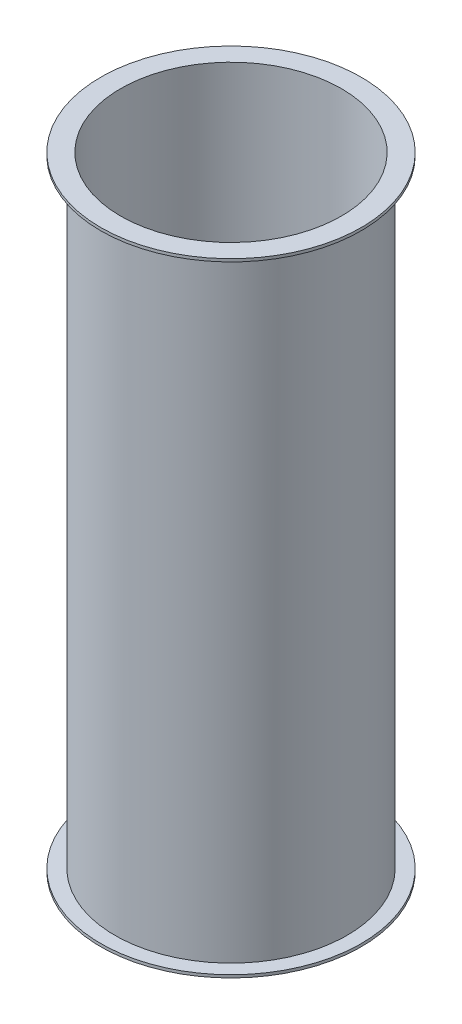
ISO-10303-21;
HEADER;
FILE_DESCRIPTION(('STEP AP214'),'2;1');
FILE_NAME('part.step','',(''),(''),'','','');
FILE_SCHEMA(('AUTOMOTIVE_DESIGN { 1 0 10303 214 1 1 1 1 }'));
ENDSEC;
DATA;
#1=APPLICATION_CONTEXT('core data for automotive mechanical design processes');
#2=APPLICATION_PROTOCOL_DEFINITION('international standard','automotive_design',2000,#1);
#3=PRODUCT_CONTEXT('',#1,'mechanical');
#4=PRODUCT('Part','Part','',(#3));
#5=PRODUCT_RELATED_PRODUCT_CATEGORY('part','',(#4));
#6=PRODUCT_DEFINITION_FORMATION('','',#4);
#7=PRODUCT_DEFINITION_CONTEXT('part definition',#1,'design');
#8=PRODUCT_DEFINITION('design','',#6,#7);
#9=PRODUCT_DEFINITION_SHAPE('','',#8);
#10=(LENGTH_UNIT() NAMED_UNIT(*) SI_UNIT(.MILLI.,.METRE.));
#11=(NAMED_UNIT(*) PLANE_ANGLE_UNIT() SI_UNIT($,.RADIAN.));
#12=(NAMED_UNIT(*) SI_UNIT($,.STERADIAN.) SOLID_ANGLE_UNIT());
#13=UNCERTAINTY_MEASURE_WITH_UNIT(LENGTH_MEASURE(1.E-05),#10,'distance_accuracy_value','');
#14=(GEOMETRIC_REPRESENTATION_CONTEXT(3) GLOBAL_UNCERTAINTY_ASSIGNED_CONTEXT((#13)) GLOBAL_UNIT_ASSIGNED_CONTEXT((#10,
#11,#12)) REPRESENTATION_CONTEXT('',''));
#15=CARTESIAN_POINT('',(0.,0.,0.));
#16=DIRECTION('',(0.,0.,1.));
#17=DIRECTION('',(1.,0.,0.));
#18=AXIS2_PLACEMENT_3D('',#15,#16,#17);
#19=CARTESIAN_POINT('',(0.,110.,0.));
#20=DIRECTION('',(0.,-1.,0.));
#21=DIRECTION('',(0.,0.,-1.));
#22=AXIS2_PLACEMENT_3D('',#19,#20,#21);
#23=CYLINDRICAL_SURFACE('',#22,41.);
#24=CARTESIAN_POINT('',(0.,109.,0.));
#25=DIRECTION('',(0.,1.,0.));
#26=DIRECTION('',(0.,0.,1.));
#27=AXIS2_PLACEMENT_3D('',#24,#25,#26);
#28=CIRCLE('',#27,41.);
#29=CARTESIAN_POINT('',(0.,109.,41.));
#30=VERTEX_POINT('',#29);
#31=EDGE_CURVE('E43',#30,#30,#28,.T.);
#32=ORIENTED_EDGE('',*,*,#31,.F.);
#33=EDGE_LOOP('',(#32));
#34=FACE_BOUND('',#33,.T.);
#35=CARTESIAN_POINT('',(0.,-109.,0.));
#36=DIRECTION('',(0.,-1.,0.));
#37=DIRECTION('',(0.,0.,-1.));
#38=AXIS2_PLACEMENT_3D('',#35,#36,#37);
#39=CIRCLE('',#38,41.);
#40=CARTESIAN_POINT('',(0.,-109.,-41.));
#41=VERTEX_POINT('',#40);
#42=EDGE_CURVE('E11',#41,#41,#39,.T.);
#43=ORIENTED_EDGE('',*,*,#42,.F.);
#44=EDGE_LOOP('',(#43));
#45=FACE_BOUND('',#44,.T.);
#46=ADVANCED_FACE('F37',(#34,#45),#23,.T.);
#47=CARTESIAN_POINT('',(0.,110.,0.));
#48=DIRECTION('',(0.,1.,0.));
#49=DIRECTION('',(0.,0.,1.));
#50=AXIS2_PLACEMENT_3D('',#47,#48,#49);
#51=PLANE('',#50);
#52=CARTESIAN_POINT('',(0.,110.,0.));
#53=DIRECTION('',(0.,1.,0.));
#54=DIRECTION('',(0.,0.,1.));
#55=AXIS2_PLACEMENT_3D('',#52,#53,#54);
#56=CIRCLE('',#55,39.);
#57=CARTESIAN_POINT('',(0.,110.,39.));
#58=VERTEX_POINT('',#57);
#59=EDGE_CURVE('E47',#58,#58,#56,.T.);
#60=ORIENTED_EDGE('',*,*,#59,.F.);
#61=EDGE_LOOP('',(#60));
#62=FACE_BOUND('',#61,.T.);
#63=CARTESIAN_POINT('',(0.,110.,0.));
#64=DIRECTION('',(0.,1.,0.));
#65=DIRECTION('',(0.,0.,1.));
#66=AXIS2_PLACEMENT_3D('',#63,#64,#65);
#67=CIRCLE('',#66,46.);
#68=CARTESIAN_POINT('',(0.,110.,46.));
#69=VERTEX_POINT('',#68);
#70=EDGE_CURVE('E57',#69,#69,#67,.T.);
#71=ORIENTED_EDGE('',*,*,#70,.T.);
#72=EDGE_LOOP('',(#71));
#73=FACE_BOUND('',#72,.T.);
#74=ADVANCED_FACE('F81',(#62,#73),#51,.T.);
#75=CARTESIAN_POINT('',(0.,-110.,0.));
#76=DIRECTION('',(0.,1.,0.));
#77=DIRECTION('',(0.,0.,1.));
#78=AXIS2_PLACEMENT_3D('',#75,#76,#77);
#79=PLANE('',#78);
#80=CARTESIAN_POINT('',(0.,-110.,0.));
#81=DIRECTION('',(0.,1.,0.));
#82=DIRECTION('',(0.,0.,1.));
#83=AXIS2_PLACEMENT_3D('',#80,#81,#82);
#84=CIRCLE('',#83,39.);
#85=CARTESIAN_POINT('',(0.,-110.,39.));
#86=VERTEX_POINT('',#85);
#87=EDGE_CURVE('E51',#86,#86,#84,.T.);
#88=ORIENTED_EDGE('',*,*,#87,.T.);
#89=EDGE_LOOP('',(#88));
#90=FACE_BOUND('',#89,.T.);
#91=CARTESIAN_POINT('',(0.,-110.,0.));
#92=DIRECTION('',(0.,-1.,0.));
#93=DIRECTION('',(0.,0.,-1.));
#94=AXIS2_PLACEMENT_3D('',#91,#92,#93);
#95=CIRCLE('',#94,46.);
#96=CARTESIAN_POINT('',(0.,-110.,-46.));
#97=VERTEX_POINT('',#96);
#98=EDGE_CURVE('E63',#97,#97,#95,.T.);
#99=ORIENTED_EDGE('',*,*,#98,.T.);
#100=EDGE_LOOP('',(#99));
#101=FACE_BOUND('',#100,.T.);
#102=ADVANCED_FACE('F86',(#90,#101),#79,.F.);
#103=CARTESIAN_POINT('',(0.,110.,0.));
#104=DIRECTION('',(0.,-1.,0.));
#105=DIRECTION('',(0.,0.,-1.));
#106=AXIS2_PLACEMENT_3D('',#103,#104,#105);
#107=CYLINDRICAL_SURFACE('',#106,39.);
#108=ORIENTED_EDGE('',*,*,#59,.T.);
#109=EDGE_LOOP('',(#108));
#110=FACE_BOUND('',#109,.T.);
#111=ORIENTED_EDGE('',*,*,#87,.F.);
#112=EDGE_LOOP('',(#111));
#113=FACE_BOUND('',#112,.T.);
#114=ADVANCED_FACE('F93',(#110,#113),#107,.F.);
#115=CARTESIAN_POINT('',(0.,109.,0.));
#116=DIRECTION('',(0.,1.,0.));
#117=DIRECTION('',(0.,0.,1.));
#118=AXIS2_PLACEMENT_3D('',#115,#116,#117);
#119=CYLINDRICAL_SURFACE('',#118,46.);
#120=CARTESIAN_POINT('',(0.,109.,0.));
#121=DIRECTION('',(0.,1.,0.));
#122=DIRECTION('',(0.,0.,1.));
#123=AXIS2_PLACEMENT_3D('',#120,#121,#122);
#124=CIRCLE('',#123,46.);
#125=CARTESIAN_POINT('',(0.,109.,46.));
#126=VERTEX_POINT('',#125);
#127=EDGE_CURVE('E55',#126,#126,#124,.T.);
#128=ORIENTED_EDGE('',*,*,#127,.T.);
#129=EDGE_LOOP('',(#128));
#130=FACE_BOUND('',#129,.T.);
#131=ORIENTED_EDGE('',*,*,#70,.F.);
#132=EDGE_LOOP('',(#131));
#133=FACE_BOUND('',#132,.T.);
#134=ADVANCED_FACE('F100',(#130,#133),#119,.T.);
#135=CARTESIAN_POINT('',(0.,109.,0.));
#136=DIRECTION('',(0.,1.,0.));
#137=DIRECTION('',(0.,0.,1.));
#138=AXIS2_PLACEMENT_3D('',#135,#136,#137);
#139=PLANE('',#138);
#140=ORIENTED_EDGE('',*,*,#31,.T.);
#141=EDGE_LOOP('',(#140));
#142=FACE_BOUND('',#141,.T.);
#143=ORIENTED_EDGE('',*,*,#127,.F.);
#144=EDGE_LOOP('',(#143));
#145=FACE_BOUND('',#144,.T.);
#146=ADVANCED_FACE('F78',(#142,#145),#139,.F.);
#147=CARTESIAN_POINT('',(0.,-109.,0.));
#148=DIRECTION('',(0.,-1.,0.));
#149=DIRECTION('',(0.,0.,-1.));
#150=AXIS2_PLACEMENT_3D('',#147,#148,#149);
#151=CYLINDRICAL_SURFACE('',#150,46.);
#152=CARTESIAN_POINT('',(0.,-109.,0.));
#153=DIRECTION('',(0.,-1.,0.));
#154=DIRECTION('',(0.,0.,-1.));
#155=AXIS2_PLACEMENT_3D('',#152,#153,#154);
#156=CIRCLE('',#155,46.);
#157=CARTESIAN_POINT('',(0.,-109.,-46.));
#158=VERTEX_POINT('',#157);
#159=EDGE_CURVE('E60',#158,#158,#156,.T.);
#160=ORIENTED_EDGE('',*,*,#159,.T.);
#161=EDGE_LOOP('',(#160));
#162=FACE_BOUND('',#161,.T.);
#163=ORIENTED_EDGE('',*,*,#98,.F.);
#164=EDGE_LOOP('',(#163));
#165=FACE_BOUND('',#164,.T.);
#166=ADVANCED_FACE('F69',(#162,#165),#151,.T.);
#167=CARTESIAN_POINT('',(0.,-109.,0.));
#168=DIRECTION('',(0.,-1.,0.));
#169=DIRECTION('',(0.,0.,-1.));
#170=AXIS2_PLACEMENT_3D('',#167,#168,#169);
#171=PLANE('',#170);
#172=ORIENTED_EDGE('',*,*,#42,.T.);
#173=EDGE_LOOP('',(#172));
#174=FACE_BOUND('',#173,.T.);
#175=ORIENTED_EDGE('',*,*,#159,.F.);
#176=EDGE_LOOP('',(#175));
#177=FACE_BOUND('',#176,.T.);
#178=ADVANCED_FACE('F72',(#174,#177),#171,.F.);
#179=CLOSED_SHELL('',(#46,#74,#102,#114,#134,#146,#166,#178));
#180=MANIFOLD_SOLID_BREP('B2',#179);
#181=ADVANCED_BREP_SHAPE_REPRESENTATION('',(#18,#180),#14);
#182=SHAPE_DEFINITION_REPRESENTATION(#9,#181);
ENDSEC;
END-ISO-10303-21;
